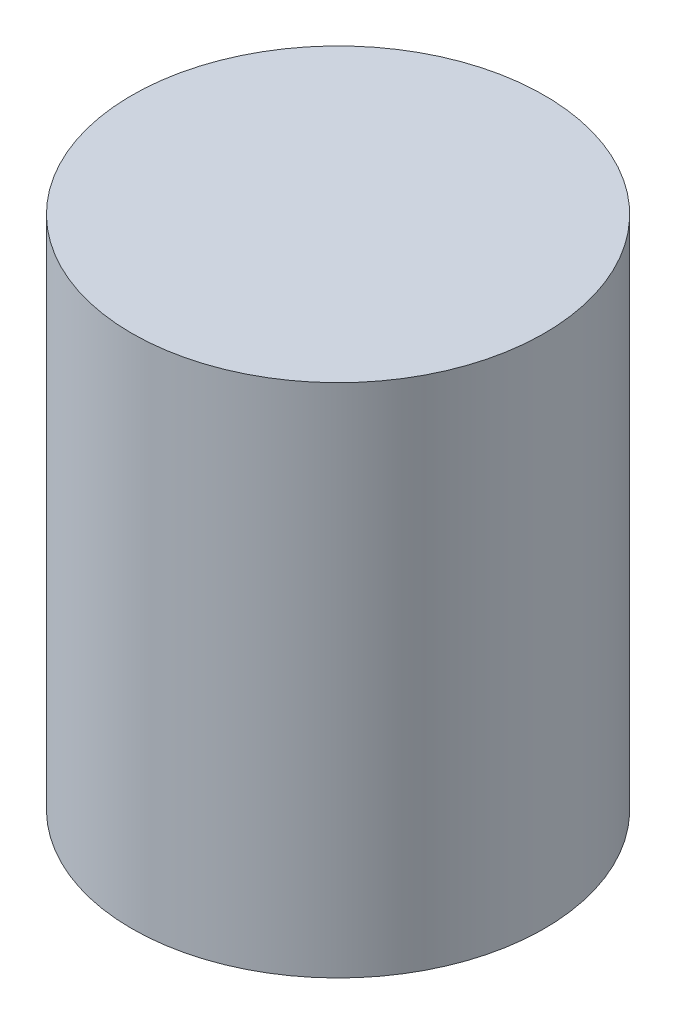
ISO-10303-21;
HEADER;
FILE_DESCRIPTION(('STEP AP214'),'2;1');
FILE_NAME('part.step','',(''),(''),'','','');
FILE_SCHEMA(('AUTOMOTIVE_DESIGN { 1 0 10303 214 1 1 1 1 }'));
ENDSEC;
DATA;
#1=APPLICATION_CONTEXT('core data for automotive mechanical design processes');
#2=APPLICATION_PROTOCOL_DEFINITION('international standard','automotive_design',2000,#1);
#3=PRODUCT_CONTEXT('',#1,'mechanical');
#4=PRODUCT('Part','Part','',(#3));
#5=PRODUCT_RELATED_PRODUCT_CATEGORY('part','',(#4));
#6=PRODUCT_DEFINITION_FORMATION('','',#4);
#7=PRODUCT_DEFINITION_CONTEXT('part definition',#1,'design');
#8=PRODUCT_DEFINITION('design','',#6,#7);
#9=PRODUCT_DEFINITION_SHAPE('','',#8);
#10=(LENGTH_UNIT() NAMED_UNIT(*) SI_UNIT(.MILLI.,.METRE.));
#11=(NAMED_UNIT(*) PLANE_ANGLE_UNIT() SI_UNIT($,.RADIAN.));
#12=(NAMED_UNIT(*) SI_UNIT($,.STERADIAN.) SOLID_ANGLE_UNIT());
#13=UNCERTAINTY_MEASURE_WITH_UNIT(LENGTH_MEASURE(1.E-05),#10,'distance_accuracy_value','');
#14=(GEOMETRIC_REPRESENTATION_CONTEXT(3) GLOBAL_UNCERTAINTY_ASSIGNED_CONTEXT((#13)) GLOBAL_UNIT_ASSIGNED_CONTEXT((#10,
#11,#12)) REPRESENTATION_CONTEXT('',''));
#15=CARTESIAN_POINT('',(0.,0.,0.));
#16=DIRECTION('',(0.,0.,1.));
#17=DIRECTION('',(1.,0.,0.));
#18=AXIS2_PLACEMENT_3D('',#15,#16,#17);
#19=CARTESIAN_POINT('',(0.,150.,0.));
#20=DIRECTION('',(0.,-1.,0.));
#21=DIRECTION('',(0.,0.,-1.));
#22=AXIS2_PLACEMENT_3D('',#19,#20,#21);
#23=CYLINDRICAL_SURFACE('',#22,60.);
#24=CARTESIAN_POINT('',(0.,150.,0.));
#25=DIRECTION('',(0.,1.,0.));
#26=DIRECTION('',(0.,0.,1.));
#27=AXIS2_PLACEMENT_3D('',#24,#25,#26);
#28=CIRCLE('',#27,60.);
#29=CARTESIAN_POINT('',(0.,150.,60.));
#30=VERTEX_POINT('',#29);
#31=EDGE_CURVE('E10',#30,#30,#28,.T.);
#32=ORIENTED_EDGE('',*,*,#31,.F.);
#33=EDGE_LOOP('',(#32));
#34=FACE_BOUND('',#33,.T.);
#35=CARTESIAN_POINT('',(0.,0.,0.));
#36=DIRECTION('',(0.,1.,0.));
#37=DIRECTION('',(0.,0.,1.));
#38=AXIS2_PLACEMENT_3D('',#35,#36,#37);
#39=CIRCLE('',#38,60.);
#40=CARTESIAN_POINT('',(0.,0.,60.));
#41=VERTEX_POINT('',#40);
#42=EDGE_CURVE('E48',#41,#41,#39,.T.);
#43=ORIENTED_EDGE('',*,*,#42,.T.);
#44=EDGE_LOOP('',(#43));
#45=FACE_BOUND('',#44,.T.);
#46=ADVANCED_FACE('F45',(#34,#45),#23,.T.);
#47=CARTESIAN_POINT('',(0.,150.,0.));
#48=DIRECTION('',(0.,1.,0.));
#49=DIRECTION('',(0.,0.,1.));
#50=AXIS2_PLACEMENT_3D('',#47,#48,#49);
#51=PLANE('',#50);
#52=ORIENTED_EDGE('',*,*,#31,.T.);
#53=EDGE_LOOP('',(#52));
#54=FACE_BOUND('',#53,.T.);
#55=ADVANCED_FACE('F62',(#54),#51,.T.);
#56=CARTESIAN_POINT('',(0.,0.,0.));
#57=DIRECTION('',(0.,1.,0.));
#58=DIRECTION('',(0.,0.,1.));
#59=AXIS2_PLACEMENT_3D('',#56,#57,#58);
#60=PLANE('',#59);
#61=ORIENTED_EDGE('',*,*,#42,.F.);
#62=EDGE_LOOP('',(#61));
#63=FACE_BOUND('',#62,.T.);
#64=ADVANCED_FACE('F60',(#63),#60,.F.);
#65=CLOSED_SHELL('',(#46,#55,#64));
#66=MANIFOLD_SOLID_BREP('B2',#65);
#67=ADVANCED_BREP_SHAPE_REPRESENTATION('',(#18,#66),#14);
#68=SHAPE_DEFINITION_REPRESENTATION(#9,#67);
ENDSEC;
END-ISO-10303-21;
